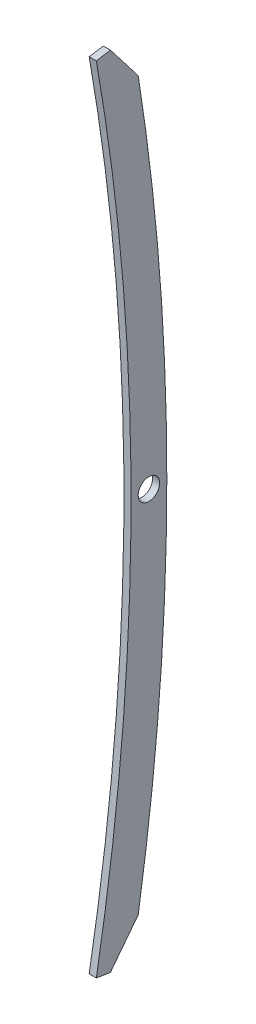
ISO-10303-21;
HEADER;
FILE_DESCRIPTION(('STEP AP214'),'2;1');
FILE_NAME('part.step','',(''),(''),'','','');
FILE_SCHEMA(('AUTOMOTIVE_DESIGN { 1 0 10303 214 1 1 1 1 }'));
ENDSEC;
DATA;
#1=APPLICATION_CONTEXT('core data for automotive mechanical design processes');
#2=APPLICATION_PROTOCOL_DEFINITION('international standard','automotive_design',2000,#1);
#3=PRODUCT_CONTEXT('',#1,'mechanical');
#4=PRODUCT('Part','Part','',(#3));
#5=PRODUCT_RELATED_PRODUCT_CATEGORY('part','',(#4));
#6=PRODUCT_DEFINITION_FORMATION('','',#4);
#7=PRODUCT_DEFINITION_CONTEXT('part definition',#1,'design');
#8=PRODUCT_DEFINITION('design','',#6,#7);
#9=PRODUCT_DEFINITION_SHAPE('','',#8);
#10=(LENGTH_UNIT() NAMED_UNIT(*) SI_UNIT(.MILLI.,.METRE.));
#11=(NAMED_UNIT(*) PLANE_ANGLE_UNIT() SI_UNIT($,.RADIAN.));
#12=(NAMED_UNIT(*) SI_UNIT($,.STERADIAN.) SOLID_ANGLE_UNIT());
#13=UNCERTAINTY_MEASURE_WITH_UNIT(LENGTH_MEASURE(1.E-05),#10,'distance_accuracy_value','');
#14=(GEOMETRIC_REPRESENTATION_CONTEXT(3) GLOBAL_UNCERTAINTY_ASSIGNED_CONTEXT((#13)) GLOBAL_UNIT_ASSIGNED_CONTEXT((#10,
#11,#12)) REPRESENTATION_CONTEXT('',''));
#15=CARTESIAN_POINT('',(0.,0.,0.));
#16=DIRECTION('',(0.,0.,1.));
#17=DIRECTION('',(1.,0.,0.));
#18=AXIS2_PLACEMENT_3D('',#15,#16,#17);
#19=CARTESIAN_POINT('',(1.27,1.11022302462516E-13,1.59872115546023E-11));
#20=DIRECTION('',(1.,0.,0.));
#21=DIRECTION('',(0.,0.,-1.));
#22=AXIS2_PLACEMENT_3D('',#19,#20,#21);
#23=PLANE('',#22);
#24=DIRECTION('',(0.,-0.156434465040233,-0.987688340595137));
#25=VECTOR('',#24,1.);
#26=CARTESIAN_POINT('',(1.27,-141.141238807682,-800.451741648323));
#27=LINE('',#26,#25);
#28=CARTESIAN_POINT('',(1.27,-141.141238807682,-800.451741648323));
#29=VERTEX_POINT('',#28);
#30=CARTESIAN_POINT('',(1.27,-141.935925890086,-805.469198418546));
#31=VERTEX_POINT('',#30);
#32=EDGE_CURVE('E135',#29,#31,#27,.T.);
#33=ORIENTED_EDGE('',*,*,#32,.T.);
#34=DIRECTION('',(0.,0.791967742579085,-0.610562932640189));
#35=VECTOR('',#34,1.);
#36=CARTESIAN_POINT('',(1.27,-141.935925890086,-805.469198418546));
#37=LINE('',#36,#35);
#38=CARTESIAN_POINT('',(1.27,-129.136650890711,-815.336725161286));
#39=VERTEX_POINT('',#38);
#40=EDGE_CURVE('E93',#31,#39,#37,.T.);
#41=ORIENTED_EDGE('',*,*,#40,.T.);
#42=CARTESIAN_POINT('',(1.27,1.11022302462516E-13,1.59872115546023E-11));
#43=DIRECTION('',(1.,0.,0.));
#44=DIRECTION('',(0.,0.,-1.));
#45=AXIS2_PLACEMENT_3D('',#42,#43,#44);
#46=CIRCLE('',#45,825.500000000016);
#47=CARTESIAN_POINT('',(1.27,129.136650890711,-815.336725161286));
#48=VERTEX_POINT('',#47);
#49=EDGE_CURVE('E106',#39,#48,#46,.T.);
#50=ORIENTED_EDGE('',*,*,#49,.T.);
#51=DIRECTION('',(0.,0.791967742579085,0.610562932640189));
#52=VECTOR('',#51,1.);
#53=CARTESIAN_POINT('',(1.27,141.935925890086,-805.469198418546));
#54=LINE('',#53,#52);
#55=CARTESIAN_POINT('',(1.27,141.935925890086,-805.469198418546));
#56=VERTEX_POINT('',#55);
#57=EDGE_CURVE('E100',#48,#56,#54,.T.);
#58=ORIENTED_EDGE('',*,*,#57,.T.);
#59=DIRECTION('',(0.,-0.156434465040233,0.987688340595137));
#60=VECTOR('',#59,1.);
#61=CARTESIAN_POINT('',(1.27,141.141238807682,-800.451741648323));
#62=LINE('',#61,#60);
#63=CARTESIAN_POINT('',(1.27,141.141238807682,-800.451741648323));
#64=VERTEX_POINT('',#63);
#65=EDGE_CURVE('E104',#56,#64,#62,.T.);
#66=ORIENTED_EDGE('',*,*,#65,.T.);
#67=CARTESIAN_POINT('',(1.27,1.11022302462516E-13,8.65973959207622E-12));
#68=DIRECTION('',(-1.,0.,0.));
#69=DIRECTION('',(0.,0.,-1.));
#70=AXIS2_PLACEMENT_3D('',#67,#68,#69);
#71=CIRCLE('',#70,812.800000000008);
#72=EDGE_CURVE('E56',#64,#29,#71,.T.);
#73=ORIENTED_EDGE('',*,*,#72,.T.);
#74=EDGE_LOOP('',(#33,#41,#50,#58,#66,#73));
#75=FACE_BOUND('',#74,.T.);
#76=CARTESIAN_POINT('',(1.27,0.,-819.15));
#77=DIRECTION('',(1.,0.,0.));
#78=DIRECTION('',(0.,0.,-1.));
#79=AXIS2_PLACEMENT_3D('',#76,#77,#78);
#80=CIRCLE('',#79,3.81000000000001);
#81=CARTESIAN_POINT('',(1.27,0.,-822.96));
#82=VERTEX_POINT('',#81);
#83=EDGE_CURVE('E128',#82,#82,#80,.T.);
#84=ORIENTED_EDGE('',*,*,#83,.F.);
#85=EDGE_LOOP('',(#84));
#86=FACE_BOUND('',#85,.T.);
#87=ADVANCED_FACE('F39',(#75,#86),#23,.T.);
#88=CARTESIAN_POINT('',(-1.27,1.11022302462516E-13,1.59872115546023E-11));
#89=DIRECTION('',(1.,0.,0.));
#90=DIRECTION('',(0.,0.,-1.));
#91=AXIS2_PLACEMENT_3D('',#88,#89,#90);
#92=PLANE('',#91);
#93=DIRECTION('',(0.,-0.156434465040233,-0.987688340595137));
#94=VECTOR('',#93,1.);
#95=CARTESIAN_POINT('',(-1.27,-141.141238807682,-800.451741648323));
#96=LINE('',#95,#94);
#97=CARTESIAN_POINT('',(-1.27,-141.141238807682,-800.451741648323));
#98=VERTEX_POINT('',#97);
#99=CARTESIAN_POINT('',(-1.27,-141.935925890086,-805.469198418546));
#100=VERTEX_POINT('',#99);
#101=EDGE_CURVE('E124',#98,#100,#96,.T.);
#102=ORIENTED_EDGE('',*,*,#101,.F.);
#103=CARTESIAN_POINT('',(-1.27,1.11022302462516E-13,8.65973959207622E-12));
#104=DIRECTION('',(-1.,0.,0.));
#105=DIRECTION('',(0.,0.,-1.));
#106=AXIS2_PLACEMENT_3D('',#103,#104,#105);
#107=CIRCLE('',#106,812.800000000008);
#108=CARTESIAN_POINT('',(-1.27,141.141238807682,-800.451741648323));
#109=VERTEX_POINT('',#108);
#110=EDGE_CURVE('E85',#109,#98,#107,.T.);
#111=ORIENTED_EDGE('',*,*,#110,.F.);
#112=DIRECTION('',(0.,-0.156434465040233,0.987688340595137));
#113=VECTOR('',#112,1.);
#114=CARTESIAN_POINT('',(-1.27,141.141238807682,-800.451741648323));
#115=LINE('',#114,#113);
#116=CARTESIAN_POINT('',(-1.27,141.935925890086,-805.469198418546));
#117=VERTEX_POINT('',#116);
#118=EDGE_CURVE('E79',#117,#109,#115,.T.);
#119=ORIENTED_EDGE('',*,*,#118,.F.);
#120=DIRECTION('',(0.,0.791967742579085,0.610562932640189));
#121=VECTOR('',#120,1.);
#122=CARTESIAN_POINT('',(-1.27,141.935925890086,-805.469198418546));
#123=LINE('',#122,#121);
#124=CARTESIAN_POINT('',(-1.27,129.136650890711,-815.336725161286));
#125=VERTEX_POINT('',#124);
#126=EDGE_CURVE('E114',#125,#117,#123,.T.);
#127=ORIENTED_EDGE('',*,*,#126,.F.);
#128=CARTESIAN_POINT('',(-1.27,1.11022302462516E-13,1.59872115546023E-11));
#129=DIRECTION('',(1.,0.,0.));
#130=DIRECTION('',(0.,0.,-1.));
#131=AXIS2_PLACEMENT_3D('',#128,#129,#130);
#132=CIRCLE('',#131,825.500000000016);
#133=CARTESIAN_POINT('',(-1.27,-129.136650890711,-815.336725161286));
#134=VERTEX_POINT('',#133);
#135=EDGE_CURVE('E130',#134,#125,#132,.T.);
#136=ORIENTED_EDGE('',*,*,#135,.F.);
#137=DIRECTION('',(0.,0.791967742579085,-0.610562932640189));
#138=VECTOR('',#137,1.);
#139=CARTESIAN_POINT('',(-1.27,-141.935925890086,-805.469198418546));
#140=LINE('',#139,#138);
#141=EDGE_CURVE('E127',#100,#134,#140,.T.);
#142=ORIENTED_EDGE('',*,*,#141,.F.);
#143=EDGE_LOOP('',(#102,#111,#119,#127,#136,#142));
#144=FACE_BOUND('',#143,.T.);
#145=CARTESIAN_POINT('',(-1.27,0.,-819.15));
#146=DIRECTION('',(1.,0.,0.));
#147=DIRECTION('',(0.,0.,-1.));
#148=AXIS2_PLACEMENT_3D('',#145,#146,#147);
#149=CIRCLE('',#148,3.81000000000001);
#150=CARTESIAN_POINT('',(-1.27,0.,-822.96));
#151=VERTEX_POINT('',#150);
#152=EDGE_CURVE('E228',#151,#151,#149,.T.);
#153=ORIENTED_EDGE('',*,*,#152,.T.);
#154=EDGE_LOOP('',(#153));
#155=FACE_BOUND('',#154,.T.);
#156=ADVANCED_FACE('F144',(#144,#155),#92,.F.);
#157=CARTESIAN_POINT('',(1.27,-141.141238807682,-800.451741648323));
#158=DIRECTION('',(0.,0.987688340595137,-0.156434465040233));
#159=DIRECTION('',(0.,0.156434465040233,0.987688340595137));
#160=AXIS2_PLACEMENT_3D('',#157,#158,#159);
#161=PLANE('',#160);
#162=ORIENTED_EDGE('',*,*,#101,.T.);
#163=DIRECTION('',(-1.,0.,0.));
#164=VECTOR('',#163,1.);
#165=CARTESIAN_POINT('',(1.27,-141.935925890086,-805.469198418546));
#166=LINE('',#165,#164);
#167=EDGE_CURVE('E11',#31,#100,#166,.T.);
#168=ORIENTED_EDGE('',*,*,#167,.F.);
#169=ORIENTED_EDGE('',*,*,#32,.F.);
#170=DIRECTION('',(-1.,0.,0.));
#171=VECTOR('',#170,1.);
#172=CARTESIAN_POINT('',(1.27,-141.141238807682,-800.451741648323));
#173=LINE('',#172,#171);
#174=EDGE_CURVE('E120',#29,#98,#173,.T.);
#175=ORIENTED_EDGE('',*,*,#174,.T.);
#176=EDGE_LOOP('',(#162,#168,#169,#175));
#177=FACE_BOUND('',#176,.T.);
#178=ADVANCED_FACE('F41',(#177),#161,.F.);
#179=CARTESIAN_POINT('',(1.27,-141.935925890086,-805.469198418546));
#180=DIRECTION('',(0.,0.610562932640189,0.791967742579085));
#181=DIRECTION('',(0.,-0.791967742579085,0.610562932640189));
#182=AXIS2_PLACEMENT_3D('',#179,#180,#181);
#183=PLANE('',#182);
#184=ORIENTED_EDGE('',*,*,#141,.T.);
#185=DIRECTION('',(-1.,0.,0.));
#186=VECTOR('',#185,1.);
#187=CARTESIAN_POINT('',(1.27,-129.136650890711,-815.336725161286));
#188=LINE('',#187,#186);
#189=EDGE_CURVE('E48',#39,#134,#188,.T.);
#190=ORIENTED_EDGE('',*,*,#189,.F.);
#191=ORIENTED_EDGE('',*,*,#40,.F.);
#192=ORIENTED_EDGE('',*,*,#167,.T.);
#193=EDGE_LOOP('',(#184,#190,#191,#192));
#194=FACE_BOUND('',#193,.T.);
#195=ADVANCED_FACE('F169',(#194),#183,.F.);
#196=CARTESIAN_POINT('',(1.27,1.11022302462516E-13,1.59872115546023E-11));
#197=DIRECTION('',(-1.,0.,0.));
#198=DIRECTION('',(0.,0.,1.));
#199=AXIS2_PLACEMENT_3D('',#196,#197,#198);
#200=CYLINDRICAL_SURFACE('',#199,825.500000000016);
#201=ORIENTED_EDGE('',*,*,#135,.T.);
#202=DIRECTION('',(-1.,0.,0.));
#203=VECTOR('',#202,1.);
#204=CARTESIAN_POINT('',(1.27,129.136650890711,-815.336725161286));
#205=LINE('',#204,#203);
#206=EDGE_CURVE('E115',#48,#125,#205,.T.);
#207=ORIENTED_EDGE('',*,*,#206,.F.);
#208=ORIENTED_EDGE('',*,*,#49,.F.);
#209=ORIENTED_EDGE('',*,*,#189,.T.);
#210=EDGE_LOOP('',(#201,#207,#208,#209));
#211=FACE_BOUND('',#210,.T.);
#212=ADVANCED_FACE('F141',(#211),#200,.T.);
#213=CARTESIAN_POINT('',(1.27,141.935925890086,-805.469198418546));
#214=DIRECTION('',(0.,-0.610562932640189,0.791967742579085));
#215=DIRECTION('',(0.,-0.791967742579085,-0.610562932640189));
#216=AXIS2_PLACEMENT_3D('',#213,#214,#215);
#217=PLANE('',#216);
#218=ORIENTED_EDGE('',*,*,#126,.T.);
#219=DIRECTION('',(-1.,0.,0.));
#220=VECTOR('',#219,1.);
#221=CARTESIAN_POINT('',(1.27,141.935925890086,-805.469198418546));
#222=LINE('',#221,#220);
#223=EDGE_CURVE('E111',#56,#117,#222,.T.);
#224=ORIENTED_EDGE('',*,*,#223,.F.);
#225=ORIENTED_EDGE('',*,*,#57,.F.);
#226=ORIENTED_EDGE('',*,*,#206,.T.);
#227=EDGE_LOOP('',(#218,#224,#225,#226));
#228=FACE_BOUND('',#227,.T.);
#229=ADVANCED_FACE('F112',(#228),#217,.F.);
#230=CARTESIAN_POINT('',(1.27,141.141238807682,-800.451741648323));
#231=DIRECTION('',(0.,-0.987688340595137,-0.156434465040233));
#232=DIRECTION('',(0.,0.156434465040233,-0.987688340595137));
#233=AXIS2_PLACEMENT_3D('',#230,#231,#232);
#234=PLANE('',#233);
#235=ORIENTED_EDGE('',*,*,#118,.T.);
#236=DIRECTION('',(-1.,0.,0.));
#237=VECTOR('',#236,1.);
#238=CARTESIAN_POINT('',(1.27,141.141238807682,-800.451741648323));
#239=LINE('',#238,#237);
#240=EDGE_CURVE('E116',#64,#109,#239,.T.);
#241=ORIENTED_EDGE('',*,*,#240,.F.);
#242=ORIENTED_EDGE('',*,*,#65,.F.);
#243=ORIENTED_EDGE('',*,*,#223,.T.);
#244=EDGE_LOOP('',(#235,#241,#242,#243));
#245=FACE_BOUND('',#244,.T.);
#246=ADVANCED_FACE('F118',(#245),#234,.F.);
#247=CARTESIAN_POINT('',(1.27,1.11022302462516E-13,8.65973959207622E-12));
#248=DIRECTION('',(-1.,0.,0.));
#249=DIRECTION('',(0.,0.,1.));
#250=AXIS2_PLACEMENT_3D('',#247,#248,#249);
#251=CYLINDRICAL_SURFACE('',#250,812.800000000008);
#252=ORIENTED_EDGE('',*,*,#110,.T.);
#253=ORIENTED_EDGE('',*,*,#174,.F.);
#254=ORIENTED_EDGE('',*,*,#72,.F.);
#255=ORIENTED_EDGE('',*,*,#240,.T.);
#256=EDGE_LOOP('',(#252,#253,#254,#255));
#257=FACE_BOUND('',#256,.T.);
#258=ADVANCED_FACE('F149',(#257),#251,.F.);
#259=CARTESIAN_POINT('',(1.27,0.,-819.15));
#260=DIRECTION('',(-1.,0.,0.));
#261=DIRECTION('',(0.,0.,1.));
#262=AXIS2_PLACEMENT_3D('',#259,#260,#261);
#263=CYLINDRICAL_SURFACE('',#262,3.81000000000001);
#264=ORIENTED_EDGE('',*,*,#83,.T.);
#265=EDGE_LOOP('',(#264));
#266=FACE_BOUND('',#265,.T.);
#267=ORIENTED_EDGE('',*,*,#152,.F.);
#268=EDGE_LOOP('',(#267));
#269=FACE_BOUND('',#268,.T.);
#270=ADVANCED_FACE('F151',(#266,#269),#263,.F.);
#271=CLOSED_SHELL('',(#87,#156,#178,#195,#212,#229,#246,#258,#270));
#272=MANIFOLD_SOLID_BREP('B2',#271);
#273=ADVANCED_BREP_SHAPE_REPRESENTATION('',(#18,#272),#14);
#274=SHAPE_DEFINITION_REPRESENTATION(#9,#273);
ENDSEC;
END-ISO-10303-21;
